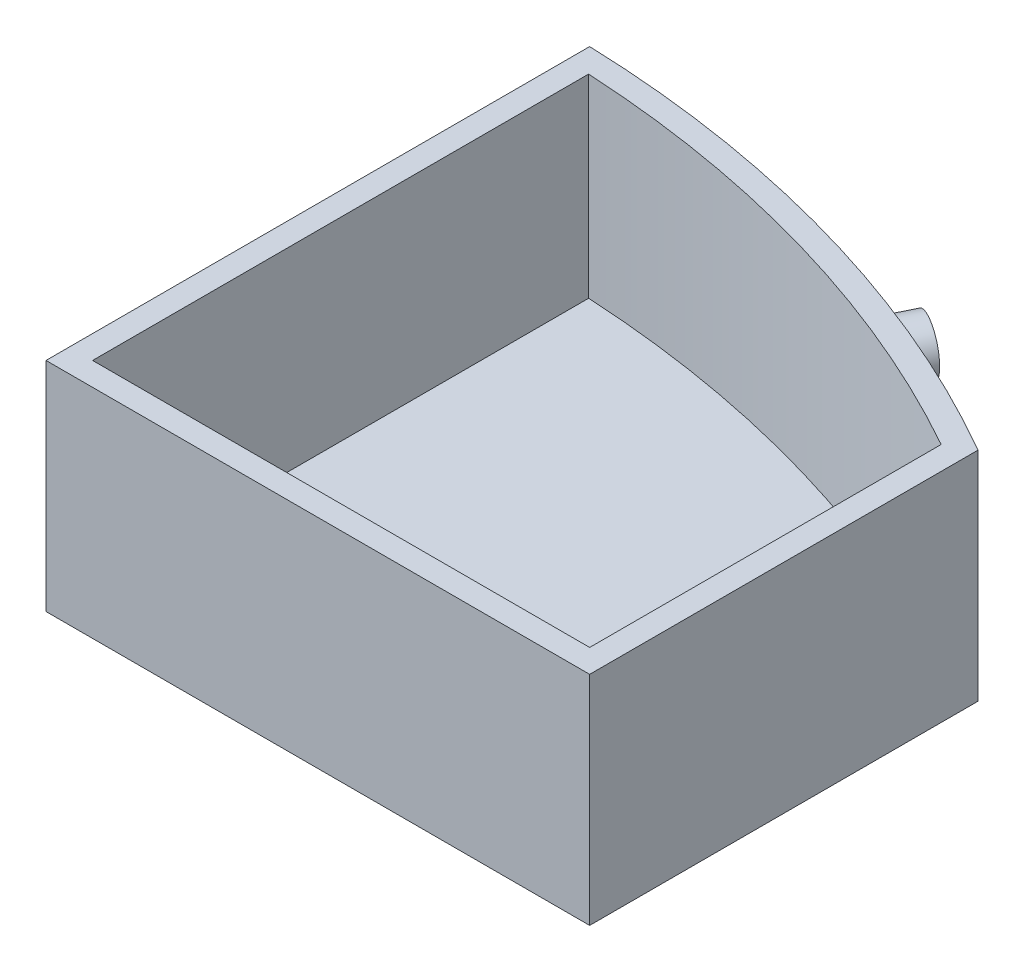
ISO-10303-21;
HEADER;
FILE_DESCRIPTION(('STEP AP214'),'2;1');
FILE_NAME('part.step','',(''),(''),'','','');
FILE_SCHEMA(('AUTOMOTIVE_DESIGN { 1 0 10303 214 1 1 1 1 }'));
ENDSEC;
DATA;
#1=APPLICATION_CONTEXT('core data for automotive mechanical design processes');
#2=APPLICATION_PROTOCOL_DEFINITION('international standard','automotive_design',2000,#1);
#3=PRODUCT_CONTEXT('',#1,'mechanical');
#4=PRODUCT('Part','Part','',(#3));
#5=PRODUCT_RELATED_PRODUCT_CATEGORY('part','',(#4));
#6=PRODUCT_DEFINITION_FORMATION('','',#4);
#7=PRODUCT_DEFINITION_CONTEXT('part definition',#1,'design');
#8=PRODUCT_DEFINITION('design','',#6,#7);
#9=PRODUCT_DEFINITION_SHAPE('','',#8);
#10=(LENGTH_UNIT() NAMED_UNIT(*) SI_UNIT(.MILLI.,.METRE.));
#11=(NAMED_UNIT(*) PLANE_ANGLE_UNIT() SI_UNIT($,.RADIAN.));
#12=(NAMED_UNIT(*) SI_UNIT($,.STERADIAN.) SOLID_ANGLE_UNIT());
#13=UNCERTAINTY_MEASURE_WITH_UNIT(LENGTH_MEASURE(1.E-05),#10,'distance_accuracy_value','');
#14=(GEOMETRIC_REPRESENTATION_CONTEXT(3) GLOBAL_UNCERTAINTY_ASSIGNED_CONTEXT((#13)) GLOBAL_UNIT_ASSIGNED_CONTEXT((#10,
#11,#12)) REPRESENTATION_CONTEXT('',''));
#15=CARTESIAN_POINT('',(0.,0.,0.));
#16=DIRECTION('',(0.,0.,1.));
#17=DIRECTION('',(1.,0.,0.));
#18=AXIS2_PLACEMENT_3D('',#15,#16,#17);
#19=CARTESIAN_POINT('',(-4.97640813713969,3.,149.917428479989));
#20=DIRECTION('',(0.,-1.,0.));
#21=DIRECTION('',(0.,0.,-1.));
#22=AXIS2_PLACEMENT_3D('',#19,#20,#21);
#23=CYLINDRICAL_SURFACE('',#22,150.);
#24=CARTESIAN_POINT('',(33.578408352206,14.,4.9569989639556));
#25=CARTESIAN_POINT('',(33.5784174337181,14.193878023667,4.95700102503197));
#26=CARTESIAN_POINT('',(33.5943427978011,14.3878979882094,4.96123410945619));
#27=CARTESIAN_POINT('',(33.6575805565443,14.7705382836714,4.97807583536704));
#28=CARTESIAN_POINT('',(33.7049308535964,14.9591518068167,4.99069459104409));
#29=CARTESIAN_POINT('',(33.8294508339707,15.3253237055683,5.02398682542493));
#30=CARTESIAN_POINT('',(33.9065931106525,15.5028920681796,5.04465290127369));
#31=CARTESIAN_POINT('',(34.0882516750176,15.8422162134257,5.09353142454111));
#32=CARTESIAN_POINT('',(34.1927623728041,16.0039752158086,5.12174233098159));
#33=CARTESIAN_POINT('',(34.4270694063957,16.3088223726357,5.18532843519724));
#34=CARTESIAN_POINT('',(34.557088287975,16.4517262088057,5.22076680503291));
#35=CARTESIAN_POINT('',(34.8379475190715,16.7133762029807,5.29779547021445));
#36=CARTESIAN_POINT('',(34.9887904019814,16.8321194173137,5.33938651412241));
#37=CARTESIAN_POINT('',(35.3098435495561,17.0442968433589,5.42851497763844));
#38=CARTESIAN_POINT('',(35.4803508725752,17.1372426958239,5.47614510076637));
#39=CARTESIAN_POINT('',(35.8336340111367,17.2925733374732,5.57556306145159));
#40=CARTESIAN_POINT('',(36.01641084237,17.3549555929944,5.62735124328986));
#41=CARTESIAN_POINT('',(36.3917486057354,17.4481862837327,5.73450926040706));
#42=CARTESIAN_POINT('',(36.5844102833815,17.4785839154851,5.78991890238147));
#43=CARTESIAN_POINT('',(36.9716813139723,17.5054496844721,5.90215694710745));
#44=CARTESIAN_POINT('',(37.1662907305745,17.5019167091213,5.9589853963208));
#45=CARTESIAN_POINT('',(37.5527190797977,17.4608574542024,6.07267167157456));
#46=CARTESIAN_POINT('',(37.7445243043124,17.4231997186192,6.12952876073494));
#47=CARTESIAN_POINT('',(38.1190690769715,17.3146269292972,6.24134117855254));
#48=CARTESIAN_POINT('',(38.3018088254147,17.2437126107143,6.29629654921952));
#49=CARTESIAN_POINT('',(38.6517966397853,17.071032979974,6.40222717987275));
#50=CARTESIAN_POINT('',(38.8191353999289,16.9694656853605,6.45322542050537));
#51=CARTESIAN_POINT('',(39.1347132362175,16.7380678176169,6.54994175547491));
#52=CARTESIAN_POINT('',(39.2829534925592,16.6082389922501,6.59566017606152));
#53=CARTESIAN_POINT('',(39.5542736974813,16.3256617115266,6.67972968630627));
#54=CARTESIAN_POINT('',(39.6776344168696,16.1732072205681,6.71816265670716));
#55=CARTESIAN_POINT('',(39.8977397662734,15.8485457021202,6.78698380598166));
#56=CARTESIAN_POINT('',(39.9944862078334,15.6763400201592,6.81737253239465));
#57=CARTESIAN_POINT('',(40.157463918317,15.3193102734784,6.8686925865255));
#58=CARTESIAN_POINT('',(40.2240497541959,15.1346638048175,6.8897337441504));
#59=CARTESIAN_POINT('',(40.3264317125385,14.7562128954281,6.9221292134849));
#60=CARTESIAN_POINT('',(40.3622294166206,14.5624089256695,6.93348402279206));
#61=CARTESIAN_POINT('',(40.4018067819448,14.1728317474883,6.94603957664307));
#62=CARTESIAN_POINT('',(40.4058439120509,13.9770872820279,6.94732197362108));
#63=CARTESIAN_POINT('',(40.3824601622207,13.5876809873504,6.93990153233278));
#64=CARTESIAN_POINT('',(40.3550399951151,13.3940191110416,6.93119892032944));
#65=CARTESIAN_POINT('',(40.2696461916701,13.0147135979997,6.90415445960965));
#66=CARTESIAN_POINT('',(40.211740694251,12.8290530743674,6.88583410812582));
#67=CARTESIAN_POINT('',(40.0671072782834,12.4705057927516,6.84022052780033));
#68=CARTESIAN_POINT('',(39.9803790846413,12.2976191567056,6.81292721331763));
#69=CARTESIAN_POINT('',(39.780200102014,11.9687411898958,6.75019402218263));
#70=CARTESIAN_POINT('',(39.6666430276148,11.8128207563811,6.71472175757444));
#71=CARTESIAN_POINT('',(39.4162567136281,11.5229331743179,6.63690484915567));
#72=CARTESIAN_POINT('',(39.2794265181211,11.388966927959,6.59455992306085));
#73=CARTESIAN_POINT('',(38.984971264113,11.1454049967388,6.50396668215668));
#74=CARTESIAN_POINT('',(38.827162323787,11.0360509711014,6.45566647683625));
#75=CARTESIAN_POINT('',(38.4962188061169,10.8462034051953,6.35503580853181));
#76=CARTESIAN_POINT('',(38.3230832729499,10.7657116664688,6.30270509421686));
#77=CARTESIAN_POINT('',(37.9640621027653,10.6348114473502,6.19494748892737));
#78=CARTESIAN_POINT('',(37.7780447892554,10.5847891216918,6.13949020994728));
#79=CARTESIAN_POINT('',(37.4004091962686,10.5176365273864,6.02773418780968));
#80=CARTESIAN_POINT('',(37.2087905248263,10.5005085662046,5.97143538590038));
#81=CARTESIAN_POINT('',(36.8231131389967,10.4995083098371,5.85896532099331));
#82=CARTESIAN_POINT('',(36.6290509577216,10.5160074158331,5.80280241651734));
#83=CARTESIAN_POINT('',(36.2460760817192,10.5825205284805,5.69278942956397));
#84=CARTESIAN_POINT('',(36.0571636112219,10.6325359920915,5.63893944773785));
#85=CARTESIAN_POINT('',(35.6890578476795,10.7650310147013,5.53475414876144));
#86=CARTESIAN_POINT('',(35.5099100574334,10.8476498580716,5.48443501656386));
#87=CARTESIAN_POINT('',(35.1674632584402,11.0431396865266,5.38888033853194));
#88=CARTESIAN_POINT('',(35.0041633730275,11.1560089969321,5.34364451148027));
#89=CARTESIAN_POINT('',(34.6993285198228,11.4081184967184,5.25969174297515));
#90=CARTESIAN_POINT('',(34.5576579662675,11.5471810697287,5.22093403403125));
#91=CARTESIAN_POINT('',(34.2991644353779,11.8483828941997,5.15055589690096));
#92=CARTESIAN_POINT('',(34.1823456366979,12.0105260188607,5.11893666894717));
#93=CARTESIAN_POINT('',(33.9789465744624,12.3505912011821,5.06408436215279));
#94=CARTESIAN_POINT('',(33.8919295458259,12.5282327474116,5.04072997031543));
#95=CARTESIAN_POINT('',(33.7486037052248,12.8961652106274,5.00235328016343));
#96=CARTESIAN_POINT('',(33.6922534541674,13.0864386662051,4.98731973766522));
#97=CARTESIAN_POINT('',(33.6276495219273,13.398378722822,4.9701024536571));
#98=CARTESIAN_POINT('',(33.6092102747661,13.5178848524076,4.96519422324207));
#99=CARTESIAN_POINT('',(33.5845869241303,13.7582422638846,4.95864185328773));
#100=CARTESIAN_POINT('',(33.5784026887815,13.8790935312872,4.95699767862444));
#101=CARTESIAN_POINT('',(33.578408352206,14.,4.9569989639556));
#102=B_SPLINE_CURVE_WITH_KNOTS('',3,(#24,#25,#26,#27,#28,#29,#30,#31,#32,#33,#34,#35,#36,#37,
#38,#39,#40,#41,#42,#43,#44,#45,#46,#47,#48,#49,#50,#51,#52,#53,#54,#55,#56,#57,#58,#59,#60,#61,
#62,#63,#64,#65,#66,#67,#68,#69,#70,#71,#72,#73,#74,#75,#76,#77,#78,#79,#80,#81,#82,#83,#84,#85,
#86,#87,#88,#89,#90,#91,#92,#93,#94,#95,#96,#97,#98,#99,#100,#101),.UNSPECIFIED.,.T.,.F.,(4,2,2,
2,2,2,2,2,2,2,2,2,2,2,2,2,2,2,2,2,2,2,2,2,2,2,2,2,2,2,2,2,2,2,2,2,2,2,4),(0.,0.581187913581577,
1.16307808937697,1.74443423512982,2.32567173356966,2.91222586620411,3.49885142044172,
4.09592360458994,4.69304527649476,5.29847466617368,5.90392390796526,6.51171543335135,
7.11949352378838,7.72342649817886,8.32732213446154,8.92396560759519,9.52056845915534,
10.1099630455001,10.6993273522223,11.2839089705853,11.868477342434,12.4517446360491,
13.0350174967283,13.6206409895926,14.2062885421508,14.7974572681962,15.3886628877172,
15.9872132030024,16.585805503706,17.1910449009282,17.796310609675,18.4041905539823,
19.0120368527349,19.6159007817895,20.2198661663627,20.8145577656525,21.4084437681126,
21.7708888412087,22.1333300140689),.UNSPECIFIED.);
#103=CARTESIAN_POINT('',(33.578408352206,14.,4.9569989639556));
#104=VERTEX_POINT('',#103);
#105=EDGE_CURVE('E134',#104,#104,#102,.T.);
#106=ORIENTED_EDGE('',*,*,#105,.F.);
#107=EDGE_LOOP('',(#106));
#108=FACE_BOUND('',#107,.T.);
#109=CARTESIAN_POINT('',(-4.97640813713969,0.,149.917428479989));
#110=DIRECTION('',(0.,1.,0.));
#111=DIRECTION('',(0.,0.,-1.));
#112=AXIS2_PLACEMENT_3D('',#109,#110,#111);
#113=CIRCLE('',#112,150.);
#114=CARTESIAN_POINT('',(70.,0.,20.));
#115=VERTEX_POINT('',#114);
#116=CARTESIAN_POINT('',(0.,0.,0.));
#117=VERTEX_POINT('',#116);
#118=EDGE_CURVE('E156',#115,#117,#113,.T.);
#119=ORIENTED_EDGE('',*,*,#118,.T.);
#120=DIRECTION('',(0.,-1.,0.));
#121=VECTOR('',#120,1.);
#122=CARTESIAN_POINT('',(0.,3.,0.));
#123=LINE('',#122,#121);
#124=CARTESIAN_POINT('',(0.,28.,0.));
#125=VERTEX_POINT('',#124);
#126=EDGE_CURVE('E11',#125,#117,#123,.T.);
#127=ORIENTED_EDGE('',*,*,#126,.F.);
#128=CARTESIAN_POINT('',(-4.97640813713969,28.,149.917428479989));
#129=DIRECTION('',(0.,1.,0.));
#130=DIRECTION('',(0.,0.,1.));
#131=AXIS2_PLACEMENT_3D('',#128,#129,#130);
#132=CIRCLE('',#131,150.);
#133=CARTESIAN_POINT('',(70.,28.,20.));
#134=VERTEX_POINT('',#133);
#135=EDGE_CURVE('E119',#134,#125,#132,.T.);
#136=ORIENTED_EDGE('',*,*,#135,.F.);
#137=DIRECTION('',(0.,-1.,0.));
#138=VECTOR('',#137,1.);
#139=CARTESIAN_POINT('',(70.,3.,20.));
#140=LINE('',#139,#138);
#141=EDGE_CURVE('E164',#134,#115,#140,.T.);
#142=ORIENTED_EDGE('',*,*,#141,.T.);
#143=EDGE_LOOP('',(#119,#127,#136,#142));
#144=FACE_BOUND('',#143,.T.);
#145=ADVANCED_FACE('F37',(#108,#144),#23,.T.);
#146=CARTESIAN_POINT('',(0.,3.,0.));
#147=DIRECTION('',(1.,0.,0.));
#148=DIRECTION('',(0.,0.,-1.));
#149=AXIS2_PLACEMENT_3D('',#146,#147,#148);
#150=PLANE('',#149);
#151=DIRECTION('',(0.,0.,1.));
#152=VECTOR('',#151,1.);
#153=CARTESIAN_POINT('',(0.,0.,0.));
#154=LINE('',#153,#152);
#155=CARTESIAN_POINT('',(0.,0.,70.));
#156=VERTEX_POINT('',#155);
#157=EDGE_CURVE('E159',#117,#156,#154,.T.);
#158=ORIENTED_EDGE('',*,*,#157,.T.);
#159=DIRECTION('',(0.,-1.,0.));
#160=VECTOR('',#159,1.);
#161=CARTESIAN_POINT('',(0.,3.,70.));
#162=LINE('',#161,#160);
#163=CARTESIAN_POINT('',(0.,28.,70.));
#164=VERTEX_POINT('',#163);
#165=EDGE_CURVE('E44',#164,#156,#162,.T.);
#166=ORIENTED_EDGE('',*,*,#165,.F.);
#167=DIRECTION('',(0.,0.,1.));
#168=VECTOR('',#167,1.);
#169=CARTESIAN_POINT('',(0.,28.,0.));
#170=LINE('',#169,#168);
#171=EDGE_CURVE('E147',#125,#164,#170,.T.);
#172=ORIENTED_EDGE('',*,*,#171,.F.);
#173=ORIENTED_EDGE('',*,*,#126,.T.);
#174=EDGE_LOOP('',(#158,#166,#172,#173));
#175=FACE_BOUND('',#174,.T.);
#176=ADVANCED_FACE('F182',(#175),#150,.F.);
#177=CARTESIAN_POINT('',(0.,3.,70.));
#178=DIRECTION('',(0.,0.,-1.));
#179=DIRECTION('',(-1.,0.,0.));
#180=AXIS2_PLACEMENT_3D('',#177,#178,#179);
#181=PLANE('',#180);
#182=DIRECTION('',(1.,0.,0.));
#183=VECTOR('',#182,1.);
#184=CARTESIAN_POINT('',(0.,0.,70.));
#185=LINE('',#184,#183);
#186=CARTESIAN_POINT('',(70.,0.,70.));
#187=VERTEX_POINT('',#186);
#188=EDGE_CURVE('E161',#156,#187,#185,.T.);
#189=ORIENTED_EDGE('',*,*,#188,.T.);
#190=DIRECTION('',(0.,-1.,0.));
#191=VECTOR('',#190,1.);
#192=CARTESIAN_POINT('',(70.,3.,70.));
#193=LINE('',#192,#191);
#194=CARTESIAN_POINT('',(70.,28.,70.));
#195=VERTEX_POINT('',#194);
#196=EDGE_CURVE('E166',#195,#187,#193,.T.);
#197=ORIENTED_EDGE('',*,*,#196,.F.);
#198=DIRECTION('',(1.,0.,0.));
#199=VECTOR('',#198,1.);
#200=CARTESIAN_POINT('',(0.,28.,70.));
#201=LINE('',#200,#199);
#202=EDGE_CURVE('E150',#164,#195,#201,.T.);
#203=ORIENTED_EDGE('',*,*,#202,.F.);
#204=ORIENTED_EDGE('',*,*,#165,.T.);
#205=EDGE_LOOP('',(#189,#197,#203,#204));
#206=FACE_BOUND('',#205,.T.);
#207=ADVANCED_FACE('F171',(#206),#181,.F.);
#208=CARTESIAN_POINT('',(70.,3.,70.));
#209=DIRECTION('',(-1.,0.,0.));
#210=DIRECTION('',(0.,0.,1.));
#211=AXIS2_PLACEMENT_3D('',#208,#209,#210);
#212=PLANE('',#211);
#213=DIRECTION('',(0.,0.,-1.));
#214=VECTOR('',#213,1.);
#215=CARTESIAN_POINT('',(70.,0.,70.));
#216=LINE('',#215,#214);
#217=EDGE_CURVE('E59',#187,#115,#216,.T.);
#218=ORIENTED_EDGE('',*,*,#217,.T.);
#219=ORIENTED_EDGE('',*,*,#141,.F.);
#220=DIRECTION('',(0.,0.,-1.));
#221=VECTOR('',#220,1.);
#222=CARTESIAN_POINT('',(70.,28.,70.));
#223=LINE('',#222,#221);
#224=EDGE_CURVE('E153',#195,#134,#223,.T.);
#225=ORIENTED_EDGE('',*,*,#224,.F.);
#226=ORIENTED_EDGE('',*,*,#196,.T.);
#227=EDGE_LOOP('',(#218,#219,#225,#226));
#228=FACE_BOUND('',#227,.T.);
#229=ADVANCED_FACE('F180',(#228),#212,.F.);
#230=CARTESIAN_POINT('',(-4.97640813713969,0.,149.917428479989));
#231=DIRECTION('',(0.,-1.,0.));
#232=DIRECTION('',(0.,0.,-1.));
#233=AXIS2_PLACEMENT_3D('',#230,#231,#232);
#234=PLANE('',#233);
#235=ORIENTED_EDGE('',*,*,#118,.F.);
#236=ORIENTED_EDGE('',*,*,#217,.F.);
#237=ORIENTED_EDGE('',*,*,#188,.F.);
#238=ORIENTED_EDGE('',*,*,#157,.F.);
#239=EDGE_LOOP('',(#235,#236,#237,#238));
#240=FACE_BOUND('',#239,.T.);
#241=ADVANCED_FACE('F176',(#240),#234,.T.);
#242=CARTESIAN_POINT('',(-4.97640813713969,28.,149.917428479989));
#243=DIRECTION('',(0.,1.,0.));
#244=DIRECTION('',(0.,0.,1.));
#245=AXIS2_PLACEMENT_3D('',#242,#243,#244);
#246=PLANE('',#245);
#247=ORIENTED_EDGE('',*,*,#135,.T.);
#248=ORIENTED_EDGE('',*,*,#171,.T.);
#249=ORIENTED_EDGE('',*,*,#202,.T.);
#250=ORIENTED_EDGE('',*,*,#224,.T.);
#251=EDGE_LOOP('',(#247,#248,#249,#250));
#252=FACE_BOUND('',#251,.T.);
#253=DIRECTION('',(0.,0.,1.));
#254=VECTOR('',#253,1.);
#255=CARTESIAN_POINT('',(3.,28.,3.13399306158158));
#256=LINE('',#255,#254);
#257=CARTESIAN_POINT('',(3.,28.,3.13399306158158));
#258=VERTEX_POINT('',#257);
#259=CARTESIAN_POINT('',(3.00000000000001,28.,67.));
#260=VERTEX_POINT('',#259);
#261=EDGE_CURVE('E111',#258,#260,#256,.T.);
#262=ORIENTED_EDGE('',*,*,#261,.F.);
#263=CARTESIAN_POINT('',(-4.97640813713969,28.,149.917428479989));
#264=DIRECTION('',(0.,1.,0.));
#265=DIRECTION('',(0.,0.,1.));
#266=AXIS2_PLACEMENT_3D('',#263,#264,#265);
#267=CIRCLE('',#266,147.);
#268=CARTESIAN_POINT('',(67.,28.,21.7441213069434));
#269=VERTEX_POINT('',#268);
#270=EDGE_CURVE('E103',#269,#258,#267,.T.);
#271=ORIENTED_EDGE('',*,*,#270,.F.);
#272=DIRECTION('',(0.,0.,-1.));
#273=VECTOR('',#272,1.);
#274=CARTESIAN_POINT('',(67.,28.,67.));
#275=LINE('',#274,#273);
#276=CARTESIAN_POINT('',(67.,28.,67.));
#277=VERTEX_POINT('',#276);
#278=EDGE_CURVE('E127',#277,#269,#275,.T.);
#279=ORIENTED_EDGE('',*,*,#278,.F.);
#280=DIRECTION('',(1.,0.,0.));
#281=VECTOR('',#280,1.);
#282=CARTESIAN_POINT('',(3.00000000000001,28.,67.));
#283=LINE('',#282,#281);
#284=EDGE_CURVE('E125',#260,#277,#283,.T.);
#285=ORIENTED_EDGE('',*,*,#284,.F.);
#286=EDGE_LOOP('',(#262,#271,#279,#285));
#287=FACE_BOUND('',#286,.T.);
#288=ADVANCED_FACE('F123',(#252,#287),#246,.T.);
#289=CARTESIAN_POINT('',(-4.97640813713969,28.,149.917428479989));
#290=DIRECTION('',(0.,-1.,0.));
#291=DIRECTION('',(0.,0.,-1.));
#292=AXIS2_PLACEMENT_3D('',#289,#290,#291);
#293=CYLINDRICAL_SURFACE('',#292,147.);
#294=CARTESIAN_POINT('',(-4.97640813713969,3.,149.917428479989));
#295=DIRECTION('',(0.,1.,0.));
#296=DIRECTION('',(0.,0.,1.));
#297=AXIS2_PLACEMENT_3D('',#294,#295,#296);
#298=CIRCLE('',#297,147.);
#299=CARTESIAN_POINT('',(67.,3.,21.7441213069434));
#300=VERTEX_POINT('',#299);
#301=CARTESIAN_POINT('',(3.,3.,3.13399306158158));
#302=VERTEX_POINT('',#301);
#303=EDGE_CURVE('E132',#300,#302,#298,.T.);
#304=ORIENTED_EDGE('',*,*,#303,.F.);
#305=DIRECTION('',(0.,-1.,0.));
#306=VECTOR('',#305,1.);
#307=CARTESIAN_POINT('',(67.,28.,21.7441213069434));
#308=LINE('',#307,#306);
#309=EDGE_CURVE('E51',#269,#300,#308,.T.);
#310=ORIENTED_EDGE('',*,*,#309,.F.);
#311=ORIENTED_EDGE('',*,*,#270,.T.);
#312=DIRECTION('',(0.,-1.,0.));
#313=VECTOR('',#312,1.);
#314=CARTESIAN_POINT('',(3.,28.,3.13399306158158));
#315=LINE('',#314,#313);
#316=EDGE_CURVE('E106',#258,#302,#315,.T.);
#317=ORIENTED_EDGE('',*,*,#316,.T.);
#318=EDGE_LOOP('',(#304,#310,#311,#317));
#319=FACE_BOUND('',#318,.T.);
#320=ADVANCED_FACE('F105',(#319),#293,.F.);
#321=CARTESIAN_POINT('',(3.,28.,3.13399306158158));
#322=DIRECTION('',(1.,0.,0.));
#323=DIRECTION('',(0.,0.,-1.));
#324=AXIS2_PLACEMENT_3D('',#321,#322,#323);
#325=PLANE('',#324);
#326=DIRECTION('',(0.,0.,1.));
#327=VECTOR('',#326,1.);
#328=CARTESIAN_POINT('',(3.,3.,3.13399306158158));
#329=LINE('',#328,#327);
#330=CARTESIAN_POINT('',(3.00000000000001,3.,67.));
#331=VERTEX_POINT('',#330);
#332=EDGE_CURVE('E118',#302,#331,#329,.T.);
#333=ORIENTED_EDGE('',*,*,#332,.F.);
#334=ORIENTED_EDGE('',*,*,#316,.F.);
#335=ORIENTED_EDGE('',*,*,#261,.T.);
#336=DIRECTION('',(0.,-1.,0.));
#337=VECTOR('',#336,1.);
#338=CARTESIAN_POINT('',(3.00000000000001,28.,67.));
#339=LINE('',#338,#337);
#340=EDGE_CURVE('E120',#260,#331,#339,.T.);
#341=ORIENTED_EDGE('',*,*,#340,.T.);
#342=EDGE_LOOP('',(#333,#334,#335,#341));
#343=FACE_BOUND('',#342,.T.);
#344=ADVANCED_FACE('F115',(#343),#325,.T.);
#345=CARTESIAN_POINT('',(3.00000000000001,28.,67.));
#346=DIRECTION('',(0.,0.,-1.));
#347=DIRECTION('',(-1.,0.,0.));
#348=AXIS2_PLACEMENT_3D('',#345,#346,#347);
#349=PLANE('',#348);
#350=DIRECTION('',(1.,0.,0.));
#351=VECTOR('',#350,1.);
#352=CARTESIAN_POINT('',(3.00000000000001,3.,67.));
#353=LINE('',#352,#351);
#354=CARTESIAN_POINT('',(67.,3.,67.));
#355=VERTEX_POINT('',#354);
#356=EDGE_CURVE('E136',#331,#355,#353,.T.);
#357=ORIENTED_EDGE('',*,*,#356,.F.);
#358=ORIENTED_EDGE('',*,*,#340,.F.);
#359=ORIENTED_EDGE('',*,*,#284,.T.);
#360=DIRECTION('',(0.,-1.,0.));
#361=VECTOR('',#360,1.);
#362=CARTESIAN_POINT('',(67.,28.,67.));
#363=LINE('',#362,#361);
#364=EDGE_CURVE('E142',#277,#355,#363,.T.);
#365=ORIENTED_EDGE('',*,*,#364,.T.);
#366=EDGE_LOOP('',(#357,#358,#359,#365));
#367=FACE_BOUND('',#366,.T.);
#368=ADVANCED_FACE('F207',(#367),#349,.T.);
#369=CARTESIAN_POINT('',(67.,28.,67.));
#370=DIRECTION('',(-1.,0.,0.));
#371=DIRECTION('',(0.,0.,1.));
#372=AXIS2_PLACEMENT_3D('',#369,#370,#371);
#373=PLANE('',#372);
#374=DIRECTION('',(0.,0.,-1.));
#375=VECTOR('',#374,1.);
#376=CARTESIAN_POINT('',(67.,3.,67.));
#377=LINE('',#376,#375);
#378=EDGE_CURVE('E112',#355,#300,#377,.T.);
#379=ORIENTED_EDGE('',*,*,#378,.F.);
#380=ORIENTED_EDGE('',*,*,#364,.F.);
#381=ORIENTED_EDGE('',*,*,#278,.T.);
#382=ORIENTED_EDGE('',*,*,#309,.T.);
#383=EDGE_LOOP('',(#379,#380,#381,#382));
#384=FACE_BOUND('',#383,.T.);
#385=ADVANCED_FACE('F199',(#384),#373,.T.);
#386=CARTESIAN_POINT('',(-4.97640813713969,3.,149.917428479989));
#387=DIRECTION('',(0.,-1.,0.));
#388=DIRECTION('',(0.,0.,-1.));
#389=AXIS2_PLACEMENT_3D('',#386,#387,#388);
#390=PLANE('',#389);
#391=ORIENTED_EDGE('',*,*,#378,.T.);
#392=ORIENTED_EDGE('',*,*,#303,.T.);
#393=ORIENTED_EDGE('',*,*,#332,.T.);
#394=ORIENTED_EDGE('',*,*,#356,.T.);
#395=EDGE_LOOP('',(#391,#392,#393,#394));
#396=FACE_BOUND('',#395,.T.);
#397=ADVANCED_FACE('F195',(#396),#390,.F.);
#398=CARTESIAN_POINT('',(4.44180275379965,14.,72.184966364864));
#399=DIRECTION('',(0.441034052986208,0.,-0.897490369924134));
#400=DIRECTION('',(-0.897490369924134,0.,-0.441034052986208));
#401=AXIS2_PLACEMENT_3D('',#398,#399,#400);
#402=CYLINDRICAL_SURFACE('',#401,3.5);
#403=ORIENTED_EDGE('',*,*,#105,.T.);
#404=EDGE_LOOP('',(#403));
#405=FACE_BOUND('',#404,.T.);
#406=CARTESIAN_POINT('',(41.0838433839493,14.,-2.38042915790884));
#407=DIRECTION('',(0.441034052986209,0.,-0.897490369924134));
#408=DIRECTION('',(-0.897490369924134,0.,-0.441034052986209));
#409=AXIS2_PLACEMENT_3D('',#406,#407,#408);
#410=CIRCLE('',#409,3.5);
#411=CARTESIAN_POINT('',(37.9426270892149,14.,-3.92404834336057));
#412=VERTEX_POINT('',#411);
#413=EDGE_CURVE('E225',#412,#412,#410,.T.);
#414=ORIENTED_EDGE('',*,*,#413,.F.);
#415=EDGE_LOOP('',(#414));
#416=FACE_BOUND('',#415,.T.);
#417=ADVANCED_FACE('F198',(#405,#416),#402,.T.);
#418=CARTESIAN_POINT('',(41.0838433839493,14.,-2.38042915790884));
#419=DIRECTION('',(0.441034052986209,0.,-0.897490369924134));
#420=DIRECTION('',(-0.897490369924134,0.,-0.441034052986209));
#421=AXIS2_PLACEMENT_3D('',#418,#419,#420);
#422=PLANE('',#421);
#423=ORIENTED_EDGE('',*,*,#413,.T.);
#424=EDGE_LOOP('',(#423));
#425=FACE_BOUND('',#424,.T.);
#426=ADVANCED_FACE('F216',(#425),#422,.T.);
#427=CLOSED_SHELL('',(#145,#176,#207,#229,#241,#288,#320,#344,#368,#385,#397,#417,#426));
#428=MANIFOLD_SOLID_BREP('B2',#427);
#429=ADVANCED_BREP_SHAPE_REPRESENTATION('',(#18,#428),#14);
#430=SHAPE_DEFINITION_REPRESENTATION(#9,#429);
ENDSEC;
END-ISO-10303-21;
